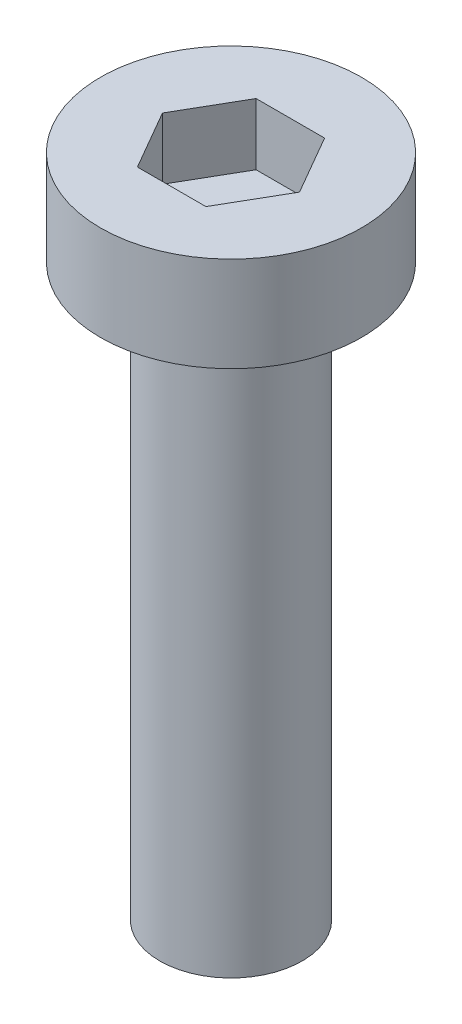
ISO-10303-21;
HEADER;
FILE_DESCRIPTION(('STEP AP214'),'2;1');
FILE_NAME('part.step','',(''),(''),'','','');
FILE_SCHEMA(('AUTOMOTIVE_DESIGN { 1 0 10303 214 1 1 1 1 }'));
ENDSEC;
DATA;
#1=APPLICATION_CONTEXT('core data for automotive mechanical design processes');
#2=APPLICATION_PROTOCOL_DEFINITION('international standard','automotive_design',2000,#1);
#3=PRODUCT_CONTEXT('',#1,'mechanical');
#4=PRODUCT('Part','Part','',(#3));
#5=PRODUCT_RELATED_PRODUCT_CATEGORY('part','',(#4));
#6=PRODUCT_DEFINITION_FORMATION('','',#4);
#7=PRODUCT_DEFINITION_CONTEXT('part definition',#1,'design');
#8=PRODUCT_DEFINITION('design','',#6,#7);
#9=PRODUCT_DEFINITION_SHAPE('','',#8);
#10=(LENGTH_UNIT() NAMED_UNIT(*) SI_UNIT(.MILLI.,.METRE.));
#11=(NAMED_UNIT(*) PLANE_ANGLE_UNIT() SI_UNIT($,.RADIAN.));
#12=(NAMED_UNIT(*) SI_UNIT($,.STERADIAN.) SOLID_ANGLE_UNIT());
#13=UNCERTAINTY_MEASURE_WITH_UNIT(LENGTH_MEASURE(1.E-05),#10,'distance_accuracy_value','');
#14=(GEOMETRIC_REPRESENTATION_CONTEXT(3) GLOBAL_UNCERTAINTY_ASSIGNED_CONTEXT((#13)) GLOBAL_UNIT_ASSIGNED_CONTEXT((#10,
#11,#12)) REPRESENTATION_CONTEXT('',''));
#15=CARTESIAN_POINT('',(0.,0.,0.));
#16=DIRECTION('',(0.,0.,1.));
#17=DIRECTION('',(1.,0.,0.));
#18=AXIS2_PLACEMENT_3D('',#15,#16,#17);
#19=CARTESIAN_POINT('',(0.,2.,0.));
#20=DIRECTION('',(0.,-1.,0.));
#21=DIRECTION('',(0.,0.,-1.));
#22=AXIS2_PLACEMENT_3D('',#19,#20,#21);
#23=CYLINDRICAL_SURFACE('',#22,2.75);
#24=CARTESIAN_POINT('',(0.,2.,0.));
#25=DIRECTION('',(0.,1.,0.));
#26=DIRECTION('',(0.,0.,1.));
#27=AXIS2_PLACEMENT_3D('',#24,#25,#26);
#28=CIRCLE('',#27,2.75);
#29=CARTESIAN_POINT('',(0.,2.,2.75));
#30=VERTEX_POINT('',#29);
#31=EDGE_CURVE('E11',#30,#30,#28,.T.);
#32=ORIENTED_EDGE('',*,*,#31,.F.);
#33=EDGE_LOOP('',(#32));
#34=FACE_BOUND('',#33,.T.);
#35=CARTESIAN_POINT('',(0.,0.,0.));
#36=DIRECTION('',(0.,1.,0.));
#37=DIRECTION('',(0.,0.,1.));
#38=AXIS2_PLACEMENT_3D('',#35,#36,#37);
#39=CIRCLE('',#38,2.75);
#40=CARTESIAN_POINT('',(0.,0.,2.75));
#41=VERTEX_POINT('',#40);
#42=EDGE_CURVE('E43',#41,#41,#39,.T.);
#43=ORIENTED_EDGE('',*,*,#42,.T.);
#44=EDGE_LOOP('',(#43));
#45=FACE_BOUND('',#44,.T.);
#46=ADVANCED_FACE('F40',(#34,#45),#23,.T.);
#47=CARTESIAN_POINT('',(0.,2.,0.));
#48=DIRECTION('',(0.,1.,0.));
#49=DIRECTION('',(0.,0.,1.));
#50=AXIS2_PLACEMENT_3D('',#47,#48,#49);
#51=PLANE('',#50);
#52=DIRECTION('',(0.5,0.,-0.866025403784439));
#53=VECTOR('',#52,1.);
#54=CARTESIAN_POINT('',(0.721687836487033,2.,1.25));
#55=LINE('',#54,#53);
#56=CARTESIAN_POINT('',(0.721687836487033,2.,1.25));
#57=VERTEX_POINT('',#56);
#58=CARTESIAN_POINT('',(1.44337567297406,2.,0.));
#59=VERTEX_POINT('',#58);
#60=EDGE_CURVE('E54',#57,#59,#55,.T.);
#61=ORIENTED_EDGE('',*,*,#60,.F.);
#62=DIRECTION('',(1.,0.,0.));
#63=VECTOR('',#62,1.);
#64=CARTESIAN_POINT('',(-0.721687836487032,2.,1.25));
#65=LINE('',#64,#63);
#66=CARTESIAN_POINT('',(-0.721687836487032,2.,1.25));
#67=VERTEX_POINT('',#66);
#68=EDGE_CURVE('E137',#67,#57,#65,.T.);
#69=ORIENTED_EDGE('',*,*,#68,.F.);
#70=DIRECTION('',(0.5,0.,0.866025403784439));
#71=VECTOR('',#70,1.);
#72=CARTESIAN_POINT('',(-1.44337567297406,2.,0.));
#73=LINE('',#72,#71);
#74=CARTESIAN_POINT('',(-1.44337567297406,2.,0.));
#75=VERTEX_POINT('',#74);
#76=EDGE_CURVE('E135',#75,#67,#73,.T.);
#77=ORIENTED_EDGE('',*,*,#76,.F.);
#78=DIRECTION('',(-0.5,0.,0.866025403784439));
#79=VECTOR('',#78,1.);
#80=CARTESIAN_POINT('',(-0.721687836487032,2.,-1.25));
#81=LINE('',#80,#79);
#82=CARTESIAN_POINT('',(-0.721687836487032,2.,-1.25));
#83=VERTEX_POINT('',#82);
#84=EDGE_CURVE('E102',#83,#75,#81,.T.);
#85=ORIENTED_EDGE('',*,*,#84,.F.);
#86=DIRECTION('',(-1.,0.,0.));
#87=VECTOR('',#86,1.);
#88=CARTESIAN_POINT('',(0.721687836487032,2.,-1.25));
#89=LINE('',#88,#87);
#90=CARTESIAN_POINT('',(0.721687836487032,2.,-1.25));
#91=VERTEX_POINT('',#90);
#92=EDGE_CURVE('E131',#91,#83,#89,.T.);
#93=ORIENTED_EDGE('',*,*,#92,.F.);
#94=DIRECTION('',(-0.5,0.,-0.866025403784438));
#95=VECTOR('',#94,1.);
#96=CARTESIAN_POINT('',(1.44337567297406,2.,0.));
#97=LINE('',#96,#95);
#98=EDGE_CURVE('E128',#59,#91,#97,.T.);
#99=ORIENTED_EDGE('',*,*,#98,.F.);
#100=EDGE_LOOP('',(#61,#69,#77,#85,#93,#99));
#101=FACE_BOUND('',#100,.T.);
#102=ORIENTED_EDGE('',*,*,#31,.T.);
#103=EDGE_LOOP('',(#102));
#104=FACE_BOUND('',#103,.T.);
#105=ADVANCED_FACE('F168',(#101,#104),#51,.T.);
#106=CARTESIAN_POINT('',(0.,0.,0.));
#107=DIRECTION('',(0.,1.,0.));
#108=DIRECTION('',(0.,0.,1.));
#109=AXIS2_PLACEMENT_3D('',#106,#107,#108);
#110=PLANE('',#109);
#111=CARTESIAN_POINT('',(0.,0.,0.));
#112=DIRECTION('',(0.,1.,0.));
#113=DIRECTION('',(0.,0.,1.));
#114=AXIS2_PLACEMENT_3D('',#111,#112,#113);
#115=CIRCLE('',#114,1.5);
#116=CARTESIAN_POINT('',(0.,0.,1.5));
#117=VERTEX_POINT('',#116);
#118=EDGE_CURVE('E141',#117,#117,#115,.T.);
#119=ORIENTED_EDGE('',*,*,#118,.T.);
#120=EDGE_LOOP('',(#119));
#121=FACE_BOUND('',#120,.T.);
#122=ORIENTED_EDGE('',*,*,#42,.F.);
#123=EDGE_LOOP('',(#122));
#124=FACE_BOUND('',#123,.T.);
#125=ADVANCED_FACE('F153',(#121,#124),#110,.F.);
#126=CARTESIAN_POINT('',(0.,-12.,0.));
#127=DIRECTION('',(0.,1.,0.));
#128=DIRECTION('',(0.,0.,1.));
#129=AXIS2_PLACEMENT_3D('',#126,#127,#128);
#130=CYLINDRICAL_SURFACE('',#129,1.5);
#131=CARTESIAN_POINT('',(0.,-12.,0.));
#132=DIRECTION('',(0.,1.,0.));
#133=DIRECTION('',(0.,0.,1.));
#134=AXIS2_PLACEMENT_3D('',#131,#132,#133);
#135=CIRCLE('',#134,1.5);
#136=CARTESIAN_POINT('',(0.,-12.,1.5));
#137=VERTEX_POINT('',#136);
#138=EDGE_CURVE('E147',#137,#137,#135,.T.);
#139=ORIENTED_EDGE('',*,*,#138,.T.);
#140=EDGE_LOOP('',(#139));
#141=FACE_BOUND('',#140,.T.);
#142=ORIENTED_EDGE('',*,*,#118,.F.);
#143=EDGE_LOOP('',(#142));
#144=FACE_BOUND('',#143,.T.);
#145=ADVANCED_FACE('F156',(#141,#144),#130,.T.);
#146=CARTESIAN_POINT('',(0.,-12.,0.));
#147=DIRECTION('',(0.,1.,0.));
#148=DIRECTION('',(0.,0.,1.));
#149=AXIS2_PLACEMENT_3D('',#146,#147,#148);
#150=PLANE('',#149);
#151=ORIENTED_EDGE('',*,*,#138,.F.);
#152=EDGE_LOOP('',(#151));
#153=FACE_BOUND('',#152,.T.);
#154=ADVANCED_FACE('F158',(#153),#150,.F.);
#155=CARTESIAN_POINT('',(0.721687836487033,0.7,1.25));
#156=DIRECTION('',(0.866025403784439,0.,0.5));
#157=DIRECTION('',(0.5,0.,-0.866025403784439));
#158=AXIS2_PLACEMENT_3D('',#155,#156,#157);
#159=PLANE('',#158);
#160=ORIENTED_EDGE('',*,*,#60,.T.);
#161=DIRECTION('',(0.,1.,0.));
#162=VECTOR('',#161,1.);
#163=CARTESIAN_POINT('',(1.44337567297406,0.7,0.));
#164=LINE('',#163,#162);
#165=CARTESIAN_POINT('',(1.44337567297406,0.7,0.));
#166=VERTEX_POINT('',#165);
#167=EDGE_CURVE('E84',#166,#59,#164,.T.);
#168=ORIENTED_EDGE('',*,*,#167,.F.);
#169=DIRECTION('',(0.5,0.,-0.866025403784439));
#170=VECTOR('',#169,1.);
#171=CARTESIAN_POINT('',(0.721687836487033,0.7,1.25));
#172=LINE('',#171,#170);
#173=CARTESIAN_POINT('',(0.721687836487033,0.7,1.25));
#174=VERTEX_POINT('',#173);
#175=EDGE_CURVE('E139',#174,#166,#172,.T.);
#176=ORIENTED_EDGE('',*,*,#175,.F.);
#177=DIRECTION('',(0.,1.,0.));
#178=VECTOR('',#177,1.);
#179=CARTESIAN_POINT('',(0.721687836487033,0.7,1.25));
#180=LINE('',#179,#178);
#181=EDGE_CURVE('E62',#174,#57,#180,.T.);
#182=ORIENTED_EDGE('',*,*,#181,.T.);
#183=EDGE_LOOP('',(#160,#168,#176,#182));
#184=FACE_BOUND('',#183,.T.);
#185=ADVANCED_FACE('F165',(#184),#159,.F.);
#186=CARTESIAN_POINT('',(-0.721687836487032,0.7,1.25));
#187=DIRECTION('',(0.,0.,1.));
#188=DIRECTION('',(1.,0.,0.));
#189=AXIS2_PLACEMENT_3D('',#186,#187,#188);
#190=PLANE('',#189);
#191=ORIENTED_EDGE('',*,*,#68,.T.);
#192=ORIENTED_EDGE('',*,*,#181,.F.);
#193=DIRECTION('',(1.,0.,0.));
#194=VECTOR('',#193,1.);
#195=CARTESIAN_POINT('',(-0.721687836487032,0.7,1.25));
#196=LINE('',#195,#194);
#197=CARTESIAN_POINT('',(-0.721687836487032,0.7,1.25));
#198=VERTEX_POINT('',#197);
#199=EDGE_CURVE('E114',#198,#174,#196,.T.);
#200=ORIENTED_EDGE('',*,*,#199,.F.);
#201=DIRECTION('',(0.,1.,0.));
#202=VECTOR('',#201,1.);
#203=CARTESIAN_POINT('',(-0.721687836487032,0.7,1.25));
#204=LINE('',#203,#202);
#205=EDGE_CURVE('E106',#198,#67,#204,.T.);
#206=ORIENTED_EDGE('',*,*,#205,.T.);
#207=EDGE_LOOP('',(#191,#192,#200,#206));
#208=FACE_BOUND('',#207,.T.);
#209=ADVANCED_FACE('F190',(#208),#190,.F.);
#210=CARTESIAN_POINT('',(-1.44337567297406,0.7,0.));
#211=DIRECTION('',(-0.866025403784439,0.,0.5));
#212=DIRECTION('',(0.5,0.,0.866025403784439));
#213=AXIS2_PLACEMENT_3D('',#210,#211,#212);
#214=PLANE('',#213);
#215=ORIENTED_EDGE('',*,*,#76,.T.);
#216=ORIENTED_EDGE('',*,*,#205,.F.);
#217=DIRECTION('',(0.5,0.,0.866025403784439));
#218=VECTOR('',#217,1.);
#219=CARTESIAN_POINT('',(-1.44337567297406,0.7,0.));
#220=LINE('',#219,#218);
#221=CARTESIAN_POINT('',(-1.44337567297406,0.7,0.));
#222=VERTEX_POINT('',#221);
#223=EDGE_CURVE('E110',#222,#198,#220,.T.);
#224=ORIENTED_EDGE('',*,*,#223,.F.);
#225=DIRECTION('',(0.,1.,0.));
#226=VECTOR('',#225,1.);
#227=CARTESIAN_POINT('',(-1.44337567297406,0.7,0.));
#228=LINE('',#227,#226);
#229=EDGE_CURVE('E95',#222,#75,#228,.T.);
#230=ORIENTED_EDGE('',*,*,#229,.T.);
#231=EDGE_LOOP('',(#215,#216,#224,#230));
#232=FACE_BOUND('',#231,.T.);
#233=ADVANCED_FACE('F111',(#232),#214,.F.);
#234=CARTESIAN_POINT('',(-0.721687836487032,0.7,-1.25));
#235=DIRECTION('',(-0.866025403784439,0.,-0.5));
#236=DIRECTION('',(-0.5,0.,0.866025403784439));
#237=AXIS2_PLACEMENT_3D('',#234,#235,#236);
#238=PLANE('',#237);
#239=ORIENTED_EDGE('',*,*,#84,.T.);
#240=ORIENTED_EDGE('',*,*,#229,.F.);
#241=DIRECTION('',(-0.5,0.,0.866025403784439));
#242=VECTOR('',#241,1.);
#243=CARTESIAN_POINT('',(-0.721687836487032,0.7,-1.25));
#244=LINE('',#243,#242);
#245=CARTESIAN_POINT('',(-0.721687836487032,0.7,-1.25));
#246=VERTEX_POINT('',#245);
#247=EDGE_CURVE('E99',#246,#222,#244,.T.);
#248=ORIENTED_EDGE('',*,*,#247,.F.);
#249=DIRECTION('',(0.,1.,0.));
#250=VECTOR('',#249,1.);
#251=CARTESIAN_POINT('',(-0.721687836487032,0.7,-1.25));
#252=LINE('',#251,#250);
#253=EDGE_CURVE('E107',#246,#83,#252,.T.);
#254=ORIENTED_EDGE('',*,*,#253,.T.);
#255=EDGE_LOOP('',(#239,#240,#248,#254));
#256=FACE_BOUND('',#255,.T.);
#257=ADVANCED_FACE('F97',(#256),#238,.F.);
#258=CARTESIAN_POINT('',(0.721687836487032,0.7,-1.25));
#259=DIRECTION('',(0.,0.,-1.));
#260=DIRECTION('',(-1.,0.,0.));
#261=AXIS2_PLACEMENT_3D('',#258,#259,#260);
#262=PLANE('',#261);
#263=ORIENTED_EDGE('',*,*,#92,.T.);
#264=ORIENTED_EDGE('',*,*,#253,.F.);
#265=DIRECTION('',(-1.,0.,0.));
#266=VECTOR('',#265,1.);
#267=CARTESIAN_POINT('',(0.721687836487032,0.7,-1.25));
#268=LINE('',#267,#266);
#269=CARTESIAN_POINT('',(0.721687836487032,0.7,-1.25));
#270=VERTEX_POINT('',#269);
#271=EDGE_CURVE('E120',#270,#246,#268,.T.);
#272=ORIENTED_EDGE('',*,*,#271,.F.);
#273=DIRECTION('',(0.,1.,0.));
#274=VECTOR('',#273,1.);
#275=CARTESIAN_POINT('',(0.721687836487032,0.7,-1.25));
#276=LINE('',#275,#274);
#277=EDGE_CURVE('E144',#270,#91,#276,.T.);
#278=ORIENTED_EDGE('',*,*,#277,.T.);
#279=EDGE_LOOP('',(#263,#264,#272,#278));
#280=FACE_BOUND('',#279,.T.);
#281=ADVANCED_FACE('F199',(#280),#262,.F.);
#282=CARTESIAN_POINT('',(1.44337567297406,0.7,0.));
#283=DIRECTION('',(0.866025403784439,0.,-0.5));
#284=DIRECTION('',(-0.5,0.,-0.866025403784439));
#285=AXIS2_PLACEMENT_3D('',#282,#283,#284);
#286=PLANE('',#285);
#287=ORIENTED_EDGE('',*,*,#98,.T.);
#288=ORIENTED_EDGE('',*,*,#277,.F.);
#289=DIRECTION('',(-0.5,0.,-0.866025403784438));
#290=VECTOR('',#289,1.);
#291=CARTESIAN_POINT('',(1.44337567297406,0.7,0.));
#292=LINE('',#291,#290);
#293=EDGE_CURVE('E122',#166,#270,#292,.T.);
#294=ORIENTED_EDGE('',*,*,#293,.F.);
#295=ORIENTED_EDGE('',*,*,#167,.T.);
#296=EDGE_LOOP('',(#287,#288,#294,#295));
#297=FACE_BOUND('',#296,.T.);
#298=ADVANCED_FACE('F187',(#297),#286,.F.);
#299=CARTESIAN_POINT('',(0.,0.7,0.));
#300=DIRECTION('',(0.,1.,0.));
#301=DIRECTION('',(0.,0.,1.));
#302=AXIS2_PLACEMENT_3D('',#299,#300,#301);
#303=PLANE('',#302);
#304=ORIENTED_EDGE('',*,*,#175,.T.);
#305=ORIENTED_EDGE('',*,*,#293,.T.);
#306=ORIENTED_EDGE('',*,*,#271,.T.);
#307=ORIENTED_EDGE('',*,*,#247,.T.);
#308=ORIENTED_EDGE('',*,*,#223,.T.);
#309=ORIENTED_EDGE('',*,*,#199,.T.);
#310=EDGE_LOOP('',(#304,#305,#306,#307,#308,#309));
#311=FACE_BOUND('',#310,.T.);
#312=ADVANCED_FACE('F117',(#311),#303,.T.);
#313=CLOSED_SHELL('',(#46,#105,#125,#145,#154,#185,#209,#233,#257,#281,#298,#312));
#314=MANIFOLD_SOLID_BREP('B2',#313);
#315=ADVANCED_BREP_SHAPE_REPRESENTATION('',(#18,#314),#14);
#316=SHAPE_DEFINITION_REPRESENTATION(#9,#315);
ENDSEC;
END-ISO-10303-21;
